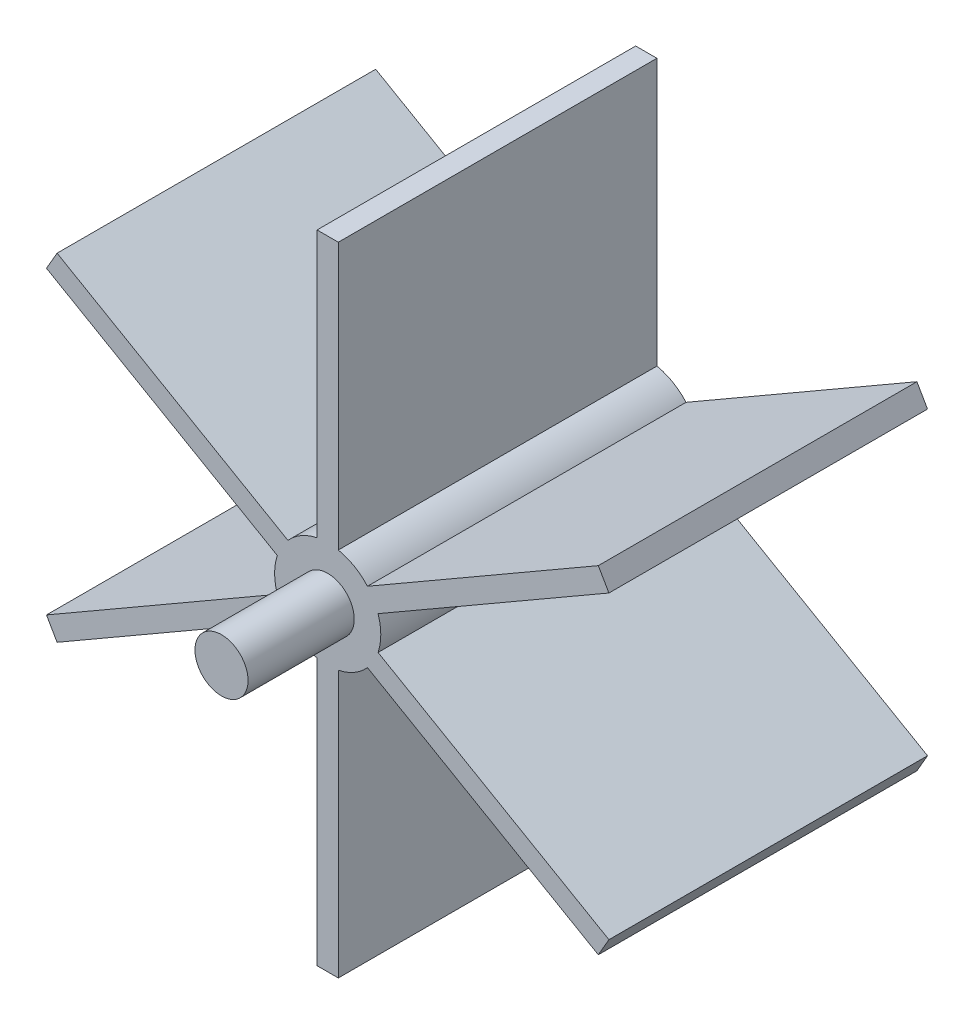
ISO-10303-21;
HEADER;
FILE_DESCRIPTION(('STEP AP214'),'2;1');
FILE_NAME('part.step','',(''),(''),'','','');
FILE_SCHEMA(('AUTOMOTIVE_DESIGN { 1 0 10303 214 1 1 1 1 }'));
ENDSEC;
DATA;
#1=APPLICATION_CONTEXT('core data for automotive mechanical design processes');
#2=APPLICATION_PROTOCOL_DEFINITION('international standard','automotive_design',2000,#1);
#3=PRODUCT_CONTEXT('',#1,'mechanical');
#4=PRODUCT('Part','Part','',(#3));
#5=PRODUCT_RELATED_PRODUCT_CATEGORY('part','',(#4));
#6=PRODUCT_DEFINITION_FORMATION('','',#4);
#7=PRODUCT_DEFINITION_CONTEXT('part definition',#1,'design');
#8=PRODUCT_DEFINITION('design','',#6,#7);
#9=PRODUCT_DEFINITION_SHAPE('','',#8);
#10=(LENGTH_UNIT() NAMED_UNIT(*) SI_UNIT(.MILLI.,.METRE.));
#11=(NAMED_UNIT(*) PLANE_ANGLE_UNIT() SI_UNIT($,.RADIAN.));
#12=(NAMED_UNIT(*) SI_UNIT($,.STERADIAN.) SOLID_ANGLE_UNIT());
#13=UNCERTAINTY_MEASURE_WITH_UNIT(LENGTH_MEASURE(1.E-05),#10,'distance_accuracy_value','');
#14=(GEOMETRIC_REPRESENTATION_CONTEXT(3) GLOBAL_UNCERTAINTY_ASSIGNED_CONTEXT((#13)) GLOBAL_UNIT_ASSIGNED_CONTEXT((#10,
#11,#12)) REPRESENTATION_CONTEXT('',''));
#15=CARTESIAN_POINT('',(0.,0.,0.));
#16=DIRECTION('',(0.,0.,1.));
#17=DIRECTION('',(1.,0.,0.));
#18=AXIS2_PLACEMENT_3D('',#15,#16,#17);
#19=CARTESIAN_POINT('',(1.27,2.19970452561247,76.2));
#20=DIRECTION('',(-0.5,-0.866025403784439,0.));
#21=DIRECTION('',(0.866025403784438,-0.5,0.));
#22=AXIS2_PLACEMENT_3D('',#19,#20,#21);
#23=PLANE('',#22);
#24=DIRECTION('',(-0.866025403784439,0.5,0.));
#25=VECTOR('',#24,1.);
#26=CARTESIAN_POINT('',(1.27,2.19970452561247,0.));
#27=LINE('',#26,#25);
#28=CARTESIAN_POINT('',(-9.50630734528298,8.42140847228175,0.));
#29=VERTEX_POINT('',#28);
#30=CARTESIAN_POINT('',(-64.7211357683742,40.2997045256125,0.));
#31=VERTEX_POINT('',#30);
#32=EDGE_CURVE('E522',#29,#31,#27,.T.);
#33=ORIENTED_EDGE('',*,*,#32,.T.);
#34=DIRECTION('',(0.,0.,-1.));
#35=VECTOR('',#34,1.);
#36=CARTESIAN_POINT('',(-64.7211357683742,40.2997045256125,76.2));
#37=LINE('',#36,#35);
#38=CARTESIAN_POINT('',(-64.7211357683742,40.2997045256125,76.2));
#39=VERTEX_POINT('',#38);
#40=EDGE_CURVE('E142',#39,#31,#37,.T.);
#41=ORIENTED_EDGE('',*,*,#40,.F.);
#42=DIRECTION('',(-0.866025403784439,0.5,0.));
#43=VECTOR('',#42,1.);
#44=CARTESIAN_POINT('',(1.27,2.19970452561247,76.2));
#45=LINE('',#44,#43);
#46=CARTESIAN_POINT('',(-9.50630734528298,8.42140847228175,76.2));
#47=VERTEX_POINT('',#46);
#48=EDGE_CURVE('E511',#47,#39,#45,.T.);
#49=ORIENTED_EDGE('',*,*,#48,.F.);
#50=DIRECTION('',(0.,0.,-1.));
#51=VECTOR('',#50,1.);
#52=CARTESIAN_POINT('',(-9.50630734528298,8.42140847228175,76.2));
#53=LINE('',#52,#51);
#54=EDGE_CURVE('E12',#47,#29,#53,.T.);
#55=ORIENTED_EDGE('',*,*,#54,.T.);
#56=EDGE_LOOP('',(#33,#41,#49,#55));
#57=FACE_BOUND('',#56,.T.);
#58=ADVANCED_FACE('F131',(#57),#23,.F.);
#59=CARTESIAN_POINT('',(-65.9911357683741,38.1000000000002,76.2));
#60=DIRECTION('',(-0.866025403784437,0.500000000000002,0.));
#61=DIRECTION('',(-0.500000000000002,-0.866025403784437,0.));
#62=AXIS2_PLACEMENT_3D('',#59,#60,#61);
#63=PLANE('',#62);
#64=DIRECTION('',(0.500000000000002,0.866025403784438,0.));
#65=VECTOR('',#64,1.);
#66=CARTESIAN_POINT('',(-65.9911357683741,38.1000000000002,0.));
#67=LINE('',#66,#65);
#68=CARTESIAN_POINT('',(-67.2611357683743,35.9002954743875,0.));
#69=VERTEX_POINT('',#68);
#70=EDGE_CURVE('E526',#69,#31,#67,.T.);
#71=ORIENTED_EDGE('',*,*,#70,.F.);
#72=DIRECTION('',(0.,0.,-1.));
#73=VECTOR('',#72,1.);
#74=CARTESIAN_POINT('',(-67.2611357683743,35.9002954743875,76.2));
#75=LINE('',#74,#73);
#76=CARTESIAN_POINT('',(-67.2611357683743,35.9002954743875,76.2));
#77=VERTEX_POINT('',#76);
#78=EDGE_CURVE('E534',#77,#69,#75,.T.);
#79=ORIENTED_EDGE('',*,*,#78,.F.);
#80=DIRECTION('',(0.500000000000002,0.866025403784438,0.));
#81=VECTOR('',#80,1.);
#82=CARTESIAN_POINT('',(-65.9911357683741,38.1000000000002,76.2));
#83=LINE('',#82,#81);
#84=EDGE_CURVE('E514',#77,#39,#83,.T.);
#85=ORIENTED_EDGE('',*,*,#84,.T.);
#86=ORIENTED_EDGE('',*,*,#40,.T.);
#87=EDGE_LOOP('',(#71,#79,#85,#86));
#88=FACE_BOUND('',#87,.T.);
#89=ADVANCED_FACE('F598',(#88),#63,.T.);
#90=CARTESIAN_POINT('',(-1.27,-2.19970452561247,76.2));
#91=DIRECTION('',(-0.5,-0.866025403784439,0.));
#92=DIRECTION('',(0.866025403784439,-0.5,0.));
#93=AXIS2_PLACEMENT_3D('',#90,#91,#92);
#94=PLANE('',#93);
#95=DIRECTION('',(-0.866025403784439,0.5,0.));
#96=VECTOR('',#95,1.);
#97=CARTESIAN_POINT('',(-1.27,-2.19970452561247,0.));
#98=LINE('',#97,#96);
#99=CARTESIAN_POINT('',(-12.046307345283,4.0219994210568,0.));
#100=VERTEX_POINT('',#99);
#101=EDGE_CURVE('E515',#100,#69,#98,.T.);
#102=ORIENTED_EDGE('',*,*,#101,.F.);
#103=DIRECTION('',(0.,0.,-1.));
#104=VECTOR('',#103,1.);
#105=CARTESIAN_POINT('',(-12.046307345283,4.0219994210568,76.2));
#106=LINE('',#105,#104);
#107=CARTESIAN_POINT('',(-12.046307345283,4.0219994210568,76.2));
#108=VERTEX_POINT('',#107);
#109=EDGE_CURVE('E151',#108,#100,#106,.T.);
#110=ORIENTED_EDGE('',*,*,#109,.F.);
#111=DIRECTION('',(-0.866025403784439,0.5,0.));
#112=VECTOR('',#111,1.);
#113=CARTESIAN_POINT('',(-1.27,-2.19970452561247,76.2));
#114=LINE('',#113,#112);
#115=EDGE_CURVE('E519',#108,#77,#114,.T.);
#116=ORIENTED_EDGE('',*,*,#115,.T.);
#117=ORIENTED_EDGE('',*,*,#78,.T.);
#118=EDGE_LOOP('',(#102,#110,#116,#117));
#119=FACE_BOUND('',#118,.T.);
#120=ADVANCED_FACE('F596',(#119),#94,.T.);
#121=CARTESIAN_POINT('',(0.,0.,0.));
#122=DIRECTION('',(0.,0.,1.));
#123=DIRECTION('',(1.,0.,0.));
#124=AXIS2_PLACEMENT_3D('',#121,#122,#123);
#125=PLANE('',#124);
#126=ORIENTED_EDGE('',*,*,#32,.F.);
#127=CARTESIAN_POINT('',(0.,0.,0.));
#128=DIRECTION('',(0.,0.,1.));
#129=DIRECTION('',(1.,0.,0.));
#130=AXIS2_PLACEMENT_3D('',#127,#128,#129);
#131=CIRCLE('',#130,12.7);
#132=CARTESIAN_POINT('',(-2.54,12.4434078933385,0.));
#133=VERTEX_POINT('',#132);
#134=EDGE_CURVE('E496',#133,#29,#131,.T.);
#135=ORIENTED_EDGE('',*,*,#134,.F.);
#136=DIRECTION('',(0.,1.,0.));
#137=VECTOR('',#136,1.);
#138=CARTESIAN_POINT('',(-2.54,0.,0.));
#139=LINE('',#138,#137);
#140=CARTESIAN_POINT('',(-2.54,76.2,0.));
#141=VERTEX_POINT('',#140);
#142=EDGE_CURVE('E543',#133,#141,#139,.T.);
#143=ORIENTED_EDGE('',*,*,#142,.T.);
#144=DIRECTION('',(1.,0.,0.));
#145=VECTOR('',#144,1.);
#146=CARTESIAN_POINT('',(0.,76.2,0.));
#147=LINE('',#146,#145);
#148=CARTESIAN_POINT('',(2.54,76.2,0.));
#149=VERTEX_POINT('',#148);
#150=EDGE_CURVE('E555',#141,#149,#147,.T.);
#151=ORIENTED_EDGE('',*,*,#150,.T.);
#152=DIRECTION('',(0.,1.,0.));
#153=VECTOR('',#152,1.);
#154=CARTESIAN_POINT('',(2.54,0.,0.));
#155=LINE('',#154,#153);
#156=CARTESIAN_POINT('',(2.54,12.4434078933385,0.));
#157=VERTEX_POINT('',#156);
#158=EDGE_CURVE('E416',#157,#149,#155,.T.);
#159=ORIENTED_EDGE('',*,*,#158,.F.);
#160=CARTESIAN_POINT('',(9.50630734528298,8.42140847228175,0.));
#161=VERTEX_POINT('',#160);
#162=EDGE_CURVE('E501',#161,#157,#131,.T.);
#163=ORIENTED_EDGE('',*,*,#162,.F.);
#164=DIRECTION('',(0.866025403784439,0.5,0.));
#165=VECTOR('',#164,1.);
#166=CARTESIAN_POINT('',(-1.27,2.19970452561247,0.));
#167=LINE('',#166,#165);
#168=CARTESIAN_POINT('',(64.7211357683742,40.2997045256125,0.));
#169=VERTEX_POINT('',#168);
#170=EDGE_CURVE('E383',#161,#169,#167,.T.);
#171=ORIENTED_EDGE('',*,*,#170,.T.);
#172=DIRECTION('',(0.500000000000002,-0.866025403784438,0.));
#173=VECTOR('',#172,1.);
#174=CARTESIAN_POINT('',(65.9911357683741,38.1000000000002,0.));
#175=LINE('',#174,#173);
#176=CARTESIAN_POINT('',(67.2611357683743,35.9002954743875,0.));
#177=VERTEX_POINT('',#176);
#178=EDGE_CURVE('E390',#169,#177,#175,.T.);
#179=ORIENTED_EDGE('',*,*,#178,.T.);
#180=DIRECTION('',(0.866025403784439,0.5,0.));
#181=VECTOR('',#180,1.);
#182=CARTESIAN_POINT('',(1.27,-2.19970452561247,0.));
#183=LINE('',#182,#181);
#184=CARTESIAN_POINT('',(12.046307345283,4.0219994210568,0.));
#185=VERTEX_POINT('',#184);
#186=EDGE_CURVE('E400',#185,#177,#183,.T.);
#187=ORIENTED_EDGE('',*,*,#186,.F.);
#188=CARTESIAN_POINT('',(12.046307345283,-4.0219994210568,0.));
#189=VERTEX_POINT('',#188);
#190=EDGE_CURVE('E581',#189,#185,#131,.T.);
#191=ORIENTED_EDGE('',*,*,#190,.F.);
#192=DIRECTION('',(0.866025403784439,-0.5,0.));
#193=VECTOR('',#192,1.);
#194=CARTESIAN_POINT('',(1.27,2.19970452561247,0.));
#195=LINE('',#194,#193);
#196=CARTESIAN_POINT('',(67.2611357683743,-35.9002954743876,0.));
#197=VERTEX_POINT('',#196);
#198=EDGE_CURVE('E421',#189,#197,#195,.T.);
#199=ORIENTED_EDGE('',*,*,#198,.T.);
#200=DIRECTION('',(0.500000000000002,0.866025403784438,0.));
#201=VECTOR('',#200,1.);
#202=CARTESIAN_POINT('',(65.9911357683742,-38.1000000000002,0.));
#203=LINE('',#202,#201);
#204=CARTESIAN_POINT('',(64.7211357683743,-40.2997045256125,0.));
#205=VERTEX_POINT('',#204);
#206=EDGE_CURVE('E430',#205,#197,#203,.T.);
#207=ORIENTED_EDGE('',*,*,#206,.F.);
#208=DIRECTION('',(0.866025403784439,-0.5,0.));
#209=VECTOR('',#208,1.);
#210=CARTESIAN_POINT('',(-1.27,-2.19970452561247,0.));
#211=LINE('',#210,#209);
#212=CARTESIAN_POINT('',(9.50630734528298,-8.42140847228175,0.));
#213=VERTEX_POINT('',#212);
#214=EDGE_CURVE('E427',#213,#205,#211,.T.);
#215=ORIENTED_EDGE('',*,*,#214,.F.);
#216=CARTESIAN_POINT('',(2.54,-12.4434078933385,0.));
#217=VERTEX_POINT('',#216);
#218=EDGE_CURVE('E314',#217,#213,#131,.T.);
#219=ORIENTED_EDGE('',*,*,#218,.F.);
#220=DIRECTION('',(0.,-1.,0.));
#221=VECTOR('',#220,1.);
#222=CARTESIAN_POINT('',(2.54,0.,0.));
#223=LINE('',#222,#221);
#224=CARTESIAN_POINT('',(2.54,-76.2,0.));
#225=VERTEX_POINT('',#224);
#226=EDGE_CURVE('E453',#217,#225,#223,.T.);
#227=ORIENTED_EDGE('',*,*,#226,.T.);
#228=DIRECTION('',(-1.,0.,0.));
#229=VECTOR('',#228,1.);
#230=CARTESIAN_POINT('',(0.,-76.2,0.));
#231=LINE('',#230,#229);
#232=CARTESIAN_POINT('',(-2.54,-76.2,0.));
#233=VERTEX_POINT('',#232);
#234=EDGE_CURVE('E464',#225,#233,#231,.T.);
#235=ORIENTED_EDGE('',*,*,#234,.T.);
#236=DIRECTION('',(0.,-1.,0.));
#237=VECTOR('',#236,1.);
#238=CARTESIAN_POINT('',(-2.54,0.,0.));
#239=LINE('',#238,#237);
#240=CARTESIAN_POINT('',(-2.54,-12.4434078933385,0.));
#241=VERTEX_POINT('',#240);
#242=EDGE_CURVE('E311',#241,#233,#239,.T.);
#243=ORIENTED_EDGE('',*,*,#242,.F.);
#244=CARTESIAN_POINT('',(-9.50630734528298,-8.42140847228175,0.));
#245=VERTEX_POINT('',#244);
#246=EDGE_CURVE('E135',#245,#241,#131,.T.);
#247=ORIENTED_EDGE('',*,*,#246,.F.);
#248=DIRECTION('',(-0.866025403784439,-0.5,0.));
#249=VECTOR('',#248,1.);
#250=CARTESIAN_POINT('',(1.27,-2.19970452561247,0.));
#251=LINE('',#250,#249);
#252=CARTESIAN_POINT('',(-64.7211357683742,-40.2997045256125,0.));
#253=VERTEX_POINT('',#252);
#254=EDGE_CURVE('E308',#245,#253,#251,.T.);
#255=ORIENTED_EDGE('',*,*,#254,.T.);
#256=DIRECTION('',(-0.500000000000002,0.866025403784438,0.));
#257=VECTOR('',#256,1.);
#258=CARTESIAN_POINT('',(-65.9911357683741,-38.1000000000002,0.));
#259=LINE('',#258,#257);
#260=CARTESIAN_POINT('',(-67.2611357683742,-35.9002954743875,0.));
#261=VERTEX_POINT('',#260);
#262=EDGE_CURVE('E319',#253,#261,#259,.T.);
#263=ORIENTED_EDGE('',*,*,#262,.T.);
#264=DIRECTION('',(-0.866025403784439,-0.5,0.));
#265=VECTOR('',#264,1.);
#266=CARTESIAN_POINT('',(-1.27,2.19970452561247,0.));
#267=LINE('',#266,#265);
#268=CARTESIAN_POINT('',(-12.046307345283,-4.0219994210568,0.));
#269=VERTEX_POINT('',#268);
#270=EDGE_CURVE('E325',#269,#261,#267,.T.);
#271=ORIENTED_EDGE('',*,*,#270,.F.);
#272=EDGE_CURVE('E315',#100,#269,#131,.T.);
#273=ORIENTED_EDGE('',*,*,#272,.F.);
#274=ORIENTED_EDGE('',*,*,#101,.T.);
#275=ORIENTED_EDGE('',*,*,#70,.T.);
#276=EDGE_LOOP('',(#126,#135,#143,#151,#159,#163,#171,#179,#187,#191,#199,#207,#215,#219,#227,
#235,#243,#247,#255,#263,#271,#273,#274,#275));
#277=FACE_BOUND('',#276,.T.);
#278=ADVANCED_FACE('F306',(#277),#125,.F.);
#279=CARTESIAN_POINT('',(0.,0.,76.2));
#280=DIRECTION('',(0.,0.,1.));
#281=DIRECTION('',(1.,0.,0.));
#282=AXIS2_PLACEMENT_3D('',#279,#280,#281);
#283=PLANE('',#282);
#284=CARTESIAN_POINT('',(0.,0.,76.2));
#285=DIRECTION('',(0.,0.,1.));
#286=DIRECTION('',(1.,0.,0.));
#287=AXIS2_PLACEMENT_3D('',#284,#285,#286);
#288=CIRCLE('',#287,6.35);
#289=CARTESIAN_POINT('',(6.35,0.,76.2));
#290=VERTEX_POINT('',#289);
#291=EDGE_CURVE('E503',#290,#290,#288,.T.);
#292=ORIENTED_EDGE('',*,*,#291,.F.);
#293=EDGE_LOOP('',(#292));
#294=FACE_BOUND('',#293,.T.);
#295=ORIENTED_EDGE('',*,*,#115,.F.);
#296=CARTESIAN_POINT('',(0.,0.,76.2));
#297=DIRECTION('',(0.,0.,1.));
#298=DIRECTION('',(1.,0.,0.));
#299=AXIS2_PLACEMENT_3D('',#296,#297,#298);
#300=CIRCLE('',#299,12.7);
#301=CARTESIAN_POINT('',(-12.046307345283,-4.0219994210568,76.2));
#302=VERTEX_POINT('',#301);
#303=EDGE_CURVE('E313',#108,#302,#300,.T.);
#304=ORIENTED_EDGE('',*,*,#303,.T.);
#305=DIRECTION('',(-0.866025403784439,-0.5,0.));
#306=VECTOR('',#305,1.);
#307=CARTESIAN_POINT('',(-1.27,2.19970452561247,76.2));
#308=LINE('',#307,#306);
#309=CARTESIAN_POINT('',(-67.2611357683742,-35.9002954743875,76.2));
#310=VERTEX_POINT('',#309);
#311=EDGE_CURVE('E318',#302,#310,#308,.T.);
#312=ORIENTED_EDGE('',*,*,#311,.T.);
#313=DIRECTION('',(-0.500000000000002,0.866025403784438,0.));
#314=VECTOR('',#313,1.);
#315=CARTESIAN_POINT('',(-65.9911357683741,-38.1000000000002,76.2));
#316=LINE('',#315,#314);
#317=CARTESIAN_POINT('',(-64.7211357683742,-40.2997045256125,76.2));
#318=VERTEX_POINT('',#317);
#319=EDGE_CURVE('E323',#318,#310,#316,.T.);
#320=ORIENTED_EDGE('',*,*,#319,.F.);
#321=DIRECTION('',(-0.866025403784439,-0.5,0.));
#322=VECTOR('',#321,1.);
#323=CARTESIAN_POINT('',(1.27,-2.19970452561247,76.2));
#324=LINE('',#323,#322);
#325=CARTESIAN_POINT('',(-9.50630734528298,-8.42140847228175,76.2));
#326=VERTEX_POINT('',#325);
#327=EDGE_CURVE('E301',#326,#318,#324,.T.);
#328=ORIENTED_EDGE('',*,*,#327,.F.);
#329=CARTESIAN_POINT('',(-2.54,-12.4434078933385,76.2));
#330=VERTEX_POINT('',#329);
#331=EDGE_CURVE('E298',#326,#330,#300,.T.);
#332=ORIENTED_EDGE('',*,*,#331,.T.);
#333=DIRECTION('',(0.,-1.,0.));
#334=VECTOR('',#333,1.);
#335=CARTESIAN_POINT('',(-2.54,0.,76.2));
#336=LINE('',#335,#334);
#337=CARTESIAN_POINT('',(-2.54,-76.2,76.2));
#338=VERTEX_POINT('',#337);
#339=EDGE_CURVE('E449',#330,#338,#336,.T.);
#340=ORIENTED_EDGE('',*,*,#339,.T.);
#341=DIRECTION('',(-1.,0.,0.));
#342=VECTOR('',#341,1.);
#343=CARTESIAN_POINT('',(0.,-76.2,76.2));
#344=LINE('',#343,#342);
#345=CARTESIAN_POINT('',(2.54,-76.2,76.2));
#346=VERTEX_POINT('',#345);
#347=EDGE_CURVE('E452',#346,#338,#344,.T.);
#348=ORIENTED_EDGE('',*,*,#347,.F.);
#349=DIRECTION('',(0.,-1.,0.));
#350=VECTOR('',#349,1.);
#351=CARTESIAN_POINT('',(2.54,0.,76.2));
#352=LINE('',#351,#350);
#353=CARTESIAN_POINT('',(2.54,-12.4434078933385,76.2));
#354=VERTEX_POINT('',#353);
#355=EDGE_CURVE('E457',#354,#346,#352,.T.);
#356=ORIENTED_EDGE('',*,*,#355,.F.);
#357=CARTESIAN_POINT('',(9.50630734528298,-8.42140847228175,76.2));
#358=VERTEX_POINT('',#357);
#359=EDGE_CURVE('E338',#354,#358,#300,.T.);
#360=ORIENTED_EDGE('',*,*,#359,.T.);
#361=DIRECTION('',(0.866025403784439,-0.5,0.));
#362=VECTOR('',#361,1.);
#363=CARTESIAN_POINT('',(-1.27,-2.19970452561247,76.2));
#364=LINE('',#363,#362);
#365=CARTESIAN_POINT('',(64.7211357683743,-40.2997045256125,76.2));
#366=VERTEX_POINT('',#365);
#367=EDGE_CURVE('E417',#358,#366,#364,.T.);
#368=ORIENTED_EDGE('',*,*,#367,.T.);
#369=DIRECTION('',(0.500000000000002,0.866025403784438,0.));
#370=VECTOR('',#369,1.);
#371=CARTESIAN_POINT('',(65.9911357683742,-38.1000000000002,76.2));
#372=LINE('',#371,#370);
#373=CARTESIAN_POINT('',(67.2611357683743,-35.9002954743876,76.2));
#374=VERTEX_POINT('',#373);
#375=EDGE_CURVE('E420',#366,#374,#372,.T.);
#376=ORIENTED_EDGE('',*,*,#375,.T.);
#377=DIRECTION('',(0.866025403784439,-0.5,0.));
#378=VECTOR('',#377,1.);
#379=CARTESIAN_POINT('',(1.27,2.19970452561247,76.2));
#380=LINE('',#379,#378);
#381=CARTESIAN_POINT('',(12.046307345283,-4.0219994210568,76.2));
#382=VERTEX_POINT('',#381);
#383=EDGE_CURVE('E372',#382,#374,#380,.T.);
#384=ORIENTED_EDGE('',*,*,#383,.F.);
#385=CARTESIAN_POINT('',(12.046307345283,4.0219994210568,76.2));
#386=VERTEX_POINT('',#385);
#387=EDGE_CURVE('E345',#382,#386,#300,.T.);
#388=ORIENTED_EDGE('',*,*,#387,.T.);
#389=DIRECTION('',(0.866025403784439,0.5,0.));
#390=VECTOR('',#389,1.);
#391=CARTESIAN_POINT('',(1.27,-2.19970452561247,76.2));
#392=LINE('',#391,#390);
#393=CARTESIAN_POINT('',(67.2611357683743,35.9002954743875,76.2));
#394=VERTEX_POINT('',#393);
#395=EDGE_CURVE('E369',#386,#394,#392,.T.);
#396=ORIENTED_EDGE('',*,*,#395,.T.);
#397=DIRECTION('',(0.500000000000002,-0.866025403784438,0.));
#398=VECTOR('',#397,1.);
#399=CARTESIAN_POINT('',(65.9911357683741,38.1000000000002,76.2));
#400=LINE('',#399,#398);
#401=CARTESIAN_POINT('',(64.7211357683742,40.2997045256125,76.2));
#402=VERTEX_POINT('',#401);
#403=EDGE_CURVE('E382',#402,#394,#400,.T.);
#404=ORIENTED_EDGE('',*,*,#403,.F.);
#405=DIRECTION('',(0.866025403784439,0.5,0.));
#406=VECTOR('',#405,1.);
#407=CARTESIAN_POINT('',(-1.27,2.19970452561247,76.2));
#408=LINE('',#407,#406);
#409=CARTESIAN_POINT('',(9.50630734528298,8.42140847228175,76.2));
#410=VERTEX_POINT('',#409);
#411=EDGE_CURVE('E387',#410,#402,#408,.T.);
#412=ORIENTED_EDGE('',*,*,#411,.F.);
#413=CARTESIAN_POINT('',(2.54,12.4434078933385,76.2));
#414=VERTEX_POINT('',#413);
#415=EDGE_CURVE('E352',#410,#414,#300,.T.);
#416=ORIENTED_EDGE('',*,*,#415,.T.);
#417=DIRECTION('',(0.,1.,0.));
#418=VECTOR('',#417,1.);
#419=CARTESIAN_POINT('',(2.54,0.,76.2));
#420=LINE('',#419,#418);
#421=CARTESIAN_POINT('',(2.54,76.2,76.2));
#422=VERTEX_POINT('',#421);
#423=EDGE_CURVE('E539',#414,#422,#420,.T.);
#424=ORIENTED_EDGE('',*,*,#423,.T.);
#425=DIRECTION('',(1.,0.,0.));
#426=VECTOR('',#425,1.);
#427=CARTESIAN_POINT('',(0.,76.2,76.2));
#428=LINE('',#427,#426);
#429=CARTESIAN_POINT('',(-2.54,76.2,76.2));
#430=VERTEX_POINT('',#429);
#431=EDGE_CURVE('E542',#430,#422,#428,.T.);
#432=ORIENTED_EDGE('',*,*,#431,.F.);
#433=DIRECTION('',(0.,1.,0.));
#434=VECTOR('',#433,1.);
#435=CARTESIAN_POINT('',(-2.54,0.,76.2));
#436=LINE('',#435,#434);
#437=CARTESIAN_POINT('',(-2.54,12.4434078933385,76.2));
#438=VERTEX_POINT('',#437);
#439=EDGE_CURVE('E547',#438,#430,#436,.T.);
#440=ORIENTED_EDGE('',*,*,#439,.F.);
#441=EDGE_CURVE('E347',#438,#47,#300,.T.);
#442=ORIENTED_EDGE('',*,*,#441,.T.);
#443=ORIENTED_EDGE('',*,*,#48,.T.);
#444=ORIENTED_EDGE('',*,*,#84,.F.);
#445=EDGE_LOOP('',(#295,#304,#312,#320,#328,#332,#340,#348,#356,#360,#368,#376,#384,#388,#396,
#404,#412,#416,#424,#432,#440,#442,#443,#444));
#446=FACE_BOUND('',#445,.T.);
#447=ADVANCED_FACE('F367',(#294,#446),#283,.T.);
#448=CARTESIAN_POINT('',(-2.54,0.,76.2));
#449=DIRECTION('',(1.,0.,0.));
#450=DIRECTION('',(0.,0.,-1.));
#451=AXIS2_PLACEMENT_3D('',#448,#449,#450);
#452=PLANE('',#451);
#453=ORIENTED_EDGE('',*,*,#242,.T.);
#454=DIRECTION('',(0.,0.,-1.));
#455=VECTOR('',#454,1.);
#456=CARTESIAN_POINT('',(-2.54,-76.2,76.2));
#457=LINE('',#456,#455);
#458=EDGE_CURVE('E475',#338,#233,#457,.T.);
#459=ORIENTED_EDGE('',*,*,#458,.F.);
#460=ORIENTED_EDGE('',*,*,#339,.F.);
#461=DIRECTION('',(0.,0.,-1.));
#462=VECTOR('',#461,1.);
#463=CARTESIAN_POINT('',(-2.54,-12.4434078933385,76.2));
#464=LINE('',#463,#462);
#465=EDGE_CURVE('E431',#330,#241,#464,.T.);
#466=ORIENTED_EDGE('',*,*,#465,.T.);
#467=EDGE_LOOP('',(#453,#459,#460,#466));
#468=FACE_BOUND('',#467,.T.);
#469=ADVANCED_FACE('F646',(#468),#452,.F.);
#470=CARTESIAN_POINT('',(0.,-76.2,76.2));
#471=DIRECTION('',(0.,-1.,0.));
#472=DIRECTION('',(0.,0.,-1.));
#473=AXIS2_PLACEMENT_3D('',#470,#471,#472);
#474=PLANE('',#473);
#475=ORIENTED_EDGE('',*,*,#234,.F.);
#476=DIRECTION('',(0.,0.,-1.));
#477=VECTOR('',#476,1.);
#478=CARTESIAN_POINT('',(2.54,-76.2,76.2));
#479=LINE('',#478,#477);
#480=EDGE_CURVE('E472',#346,#225,#479,.T.);
#481=ORIENTED_EDGE('',*,*,#480,.F.);
#482=ORIENTED_EDGE('',*,*,#347,.T.);
#483=ORIENTED_EDGE('',*,*,#458,.T.);
#484=EDGE_LOOP('',(#475,#481,#482,#483));
#485=FACE_BOUND('',#484,.T.);
#486=ADVANCED_FACE('F642',(#485),#474,.T.);
#487=CARTESIAN_POINT('',(2.54,0.,76.2));
#488=DIRECTION('',(1.,0.,0.));
#489=DIRECTION('',(0.,0.,-1.));
#490=AXIS2_PLACEMENT_3D('',#487,#488,#489);
#491=PLANE('',#490);
#492=ORIENTED_EDGE('',*,*,#226,.F.);
#493=DIRECTION('',(0.,0.,-1.));
#494=VECTOR('',#493,1.);
#495=CARTESIAN_POINT('',(2.54,-12.4434078933385,76.2));
#496=LINE('',#495,#494);
#497=EDGE_CURVE('E461',#354,#217,#496,.T.);
#498=ORIENTED_EDGE('',*,*,#497,.F.);
#499=ORIENTED_EDGE('',*,*,#355,.T.);
#500=ORIENTED_EDGE('',*,*,#480,.T.);
#501=EDGE_LOOP('',(#492,#498,#499,#500));
#502=FACE_BOUND('',#501,.T.);
#503=ADVANCED_FACE('F638',(#502),#491,.T.);
#504=CARTESIAN_POINT('',(-1.27,-2.19970452561247,76.2));
#505=DIRECTION('',(0.5,0.866025403784439,0.));
#506=DIRECTION('',(-0.866025403784438,0.5,0.));
#507=AXIS2_PLACEMENT_3D('',#504,#505,#506);
#508=PLANE('',#507);
#509=ORIENTED_EDGE('',*,*,#214,.T.);
#510=DIRECTION('',(0.,0.,-1.));
#511=VECTOR('',#510,1.);
#512=CARTESIAN_POINT('',(64.7211357683743,-40.2997045256125,76.2));
#513=LINE('',#512,#511);
#514=EDGE_CURVE('E443',#366,#205,#513,.T.);
#515=ORIENTED_EDGE('',*,*,#514,.F.);
#516=ORIENTED_EDGE('',*,*,#367,.F.);
#517=DIRECTION('',(0.,0.,-1.));
#518=VECTOR('',#517,1.);
#519=CARTESIAN_POINT('',(9.50630734528298,-8.42140847228175,76.2));
#520=LINE('',#519,#518);
#521=EDGE_CURVE('E403',#358,#213,#520,.T.);
#522=ORIENTED_EDGE('',*,*,#521,.T.);
#523=EDGE_LOOP('',(#509,#515,#516,#522));
#524=FACE_BOUND('',#523,.T.);
#525=ADVANCED_FACE('F634',(#524),#508,.F.);
#526=CARTESIAN_POINT('',(65.9911357683742,-38.1000000000002,76.2));
#527=DIRECTION('',(-0.866025403784437,0.500000000000002,0.));
#528=DIRECTION('',(-0.500000000000002,-0.866025403784437,0.));
#529=AXIS2_PLACEMENT_3D('',#526,#527,#528);
#530=PLANE('',#529);
#531=ORIENTED_EDGE('',*,*,#206,.T.);
#532=DIRECTION('',(0.,0.,-1.));
#533=VECTOR('',#532,1.);
#534=CARTESIAN_POINT('',(67.2611357683743,-35.9002954743876,76.2));
#535=LINE('',#534,#533);
#536=EDGE_CURVE('E440',#374,#197,#535,.T.);
#537=ORIENTED_EDGE('',*,*,#536,.F.);
#538=ORIENTED_EDGE('',*,*,#375,.F.);
#539=ORIENTED_EDGE('',*,*,#514,.T.);
#540=EDGE_LOOP('',(#531,#537,#538,#539));
#541=FACE_BOUND('',#540,.T.);
#542=ADVANCED_FACE('F629',(#541),#530,.F.);
#543=CARTESIAN_POINT('',(1.27,2.19970452561247,76.2));
#544=DIRECTION('',(0.5,0.866025403784439,0.));
#545=DIRECTION('',(-0.866025403784439,0.5,0.));
#546=AXIS2_PLACEMENT_3D('',#543,#544,#545);
#547=PLANE('',#546);
#548=ORIENTED_EDGE('',*,*,#198,.F.);
#549=DIRECTION('',(0.,0.,-1.));
#550=VECTOR('',#549,1.);
#551=CARTESIAN_POINT('',(12.046307345283,-4.0219994210568,76.2));
#552=LINE('',#551,#550);
#553=EDGE_CURVE('E426',#382,#189,#552,.T.);
#554=ORIENTED_EDGE('',*,*,#553,.F.);
#555=ORIENTED_EDGE('',*,*,#383,.T.);
#556=ORIENTED_EDGE('',*,*,#536,.T.);
#557=EDGE_LOOP('',(#548,#554,#555,#556));
#558=FACE_BOUND('',#557,.T.);
#559=ADVANCED_FACE('F626',(#558),#547,.T.);
#560=CARTESIAN_POINT('',(1.27,-2.19970452561247,76.2));
#561=DIRECTION('',(-0.5,0.866025403784439,0.));
#562=DIRECTION('',(-0.866025403784439,-0.5,0.));
#563=AXIS2_PLACEMENT_3D('',#560,#561,#562);
#564=PLANE('',#563);
#565=ORIENTED_EDGE('',*,*,#186,.T.);
#566=DIRECTION('',(0.,0.,-1.));
#567=VECTOR('',#566,1.);
#568=CARTESIAN_POINT('',(67.2611357683743,35.9002954743875,76.2));
#569=LINE('',#568,#567);
#570=EDGE_CURVE('E379',#394,#177,#569,.T.);
#571=ORIENTED_EDGE('',*,*,#570,.F.);
#572=ORIENTED_EDGE('',*,*,#395,.F.);
#573=DIRECTION('',(0.,0.,-1.));
#574=VECTOR('',#573,1.);
#575=CARTESIAN_POINT('',(12.046307345283,4.0219994210568,76.2));
#576=LINE('',#575,#574);
#577=EDGE_CURVE('E377',#386,#185,#576,.T.);
#578=ORIENTED_EDGE('',*,*,#577,.T.);
#579=EDGE_LOOP('',(#565,#571,#572,#578));
#580=FACE_BOUND('',#579,.T.);
#581=ADVANCED_FACE('F376',(#580),#564,.F.);
#582=CARTESIAN_POINT('',(65.9911357683741,38.1000000000002,76.2));
#583=DIRECTION('',(0.866025403784437,0.500000000000002,0.));
#584=DIRECTION('',(-0.500000000000002,0.866025403784437,0.));
#585=AXIS2_PLACEMENT_3D('',#582,#583,#584);
#586=PLANE('',#585);
#587=ORIENTED_EDGE('',*,*,#178,.F.);
#588=DIRECTION('',(0.,0.,-1.));
#589=VECTOR('',#588,1.);
#590=CARTESIAN_POINT('',(64.7211357683742,40.2997045256125,76.2));
#591=LINE('',#590,#589);
#592=EDGE_CURVE('E409',#402,#169,#591,.T.);
#593=ORIENTED_EDGE('',*,*,#592,.F.);
#594=ORIENTED_EDGE('',*,*,#403,.T.);
#595=ORIENTED_EDGE('',*,*,#570,.T.);
#596=EDGE_LOOP('',(#587,#593,#594,#595));
#597=FACE_BOUND('',#596,.T.);
#598=ADVANCED_FACE('F618',(#597),#586,.T.);
#599=CARTESIAN_POINT('',(-1.27,2.19970452561247,76.2));
#600=DIRECTION('',(-0.5,0.866025403784439,0.));
#601=DIRECTION('',(-0.866025403784438,-0.5,0.));
#602=AXIS2_PLACEMENT_3D('',#599,#600,#601);
#603=PLANE('',#602);
#604=ORIENTED_EDGE('',*,*,#170,.F.);
#605=DIRECTION('',(0.,0.,-1.));
#606=VECTOR('',#605,1.);
#607=CARTESIAN_POINT('',(9.50630734528298,8.42140847228175,76.2));
#608=LINE('',#607,#606);
#609=EDGE_CURVE('E399',#410,#161,#608,.T.);
#610=ORIENTED_EDGE('',*,*,#609,.F.);
#611=ORIENTED_EDGE('',*,*,#411,.T.);
#612=ORIENTED_EDGE('',*,*,#592,.T.);
#613=EDGE_LOOP('',(#604,#610,#611,#612));
#614=FACE_BOUND('',#613,.T.);
#615=ADVANCED_FACE('F615',(#614),#603,.T.);
#616=CARTESIAN_POINT('',(2.54,0.,76.2));
#617=DIRECTION('',(-1.,0.,0.));
#618=DIRECTION('',(0.,0.,1.));
#619=AXIS2_PLACEMENT_3D('',#616,#617,#618);
#620=PLANE('',#619);
#621=ORIENTED_EDGE('',*,*,#158,.T.);
#622=DIRECTION('',(0.,0.,-1.));
#623=VECTOR('',#622,1.);
#624=CARTESIAN_POINT('',(2.54,76.2,76.2));
#625=LINE('',#624,#623);
#626=EDGE_CURVE('E566',#422,#149,#625,.T.);
#627=ORIENTED_EDGE('',*,*,#626,.F.);
#628=ORIENTED_EDGE('',*,*,#423,.F.);
#629=DIRECTION('',(0.,0.,-1.));
#630=VECTOR('',#629,1.);
#631=CARTESIAN_POINT('',(2.54,12.4434078933385,76.2));
#632=LINE('',#631,#630);
#633=EDGE_CURVE('E393',#414,#157,#632,.T.);
#634=ORIENTED_EDGE('',*,*,#633,.T.);
#635=EDGE_LOOP('',(#621,#627,#628,#634));
#636=FACE_BOUND('',#635,.T.);
#637=ADVANCED_FACE('F574',(#636),#620,.F.);
#638=CARTESIAN_POINT('',(0.,76.2,76.2));
#639=DIRECTION('',(0.,1.,0.));
#640=DIRECTION('',(0.,0.,1.));
#641=AXIS2_PLACEMENT_3D('',#638,#639,#640);
#642=PLANE('',#641);
#643=ORIENTED_EDGE('',*,*,#150,.F.);
#644=DIRECTION('',(0.,0.,-1.));
#645=VECTOR('',#644,1.);
#646=CARTESIAN_POINT('',(-2.54,76.2,76.2));
#647=LINE('',#646,#645);
#648=EDGE_CURVE('E564',#430,#141,#647,.T.);
#649=ORIENTED_EDGE('',*,*,#648,.F.);
#650=ORIENTED_EDGE('',*,*,#431,.T.);
#651=ORIENTED_EDGE('',*,*,#626,.T.);
#652=EDGE_LOOP('',(#643,#649,#650,#651));
#653=FACE_BOUND('',#652,.T.);
#654=ADVANCED_FACE('F584',(#653),#642,.T.);
#655=CARTESIAN_POINT('',(-65.9911357683741,-38.1000000000002,76.2));
#656=DIRECTION('',(-0.866025403784437,-0.500000000000002,0.));
#657=DIRECTION('',(0.500000000000002,-0.866025403784437,0.));
#658=AXIS2_PLACEMENT_3D('',#655,#656,#657);
#659=PLANE('',#658);
#660=ORIENTED_EDGE('',*,*,#262,.F.);
#661=DIRECTION('',(0.,0.,-1.));
#662=VECTOR('',#661,1.);
#663=CARTESIAN_POINT('',(-64.7211357683742,-40.2997045256125,76.2));
#664=LINE('',#663,#662);
#665=EDGE_CURVE('E287',#318,#253,#664,.T.);
#666=ORIENTED_EDGE('',*,*,#665,.F.);
#667=ORIENTED_EDGE('',*,*,#319,.T.);
#668=DIRECTION('',(0.,0.,-1.));
#669=VECTOR('',#668,1.);
#670=CARTESIAN_POINT('',(-67.2611357683742,-35.9002954743875,76.2));
#671=LINE('',#670,#669);
#672=EDGE_CURVE('E331',#310,#261,#671,.T.);
#673=ORIENTED_EDGE('',*,*,#672,.T.);
#674=EDGE_LOOP('',(#660,#666,#667,#673));
#675=FACE_BOUND('',#674,.T.);
#676=ADVANCED_FACE('F488',(#675),#659,.T.);
#677=CARTESIAN_POINT('',(1.27,-2.19970452561247,76.2));
#678=DIRECTION('',(0.5,-0.866025403784439,0.));
#679=DIRECTION('',(0.866025403784438,0.5,0.));
#680=AXIS2_PLACEMENT_3D('',#677,#678,#679);
#681=PLANE('',#680);
#682=ORIENTED_EDGE('',*,*,#254,.F.);
#683=DIRECTION('',(0.,0.,-1.));
#684=VECTOR('',#683,1.);
#685=CARTESIAN_POINT('',(-9.50630734528298,-8.42140847228175,76.2));
#686=LINE('',#685,#684);
#687=EDGE_CURVE('E293',#326,#245,#686,.T.);
#688=ORIENTED_EDGE('',*,*,#687,.F.);
#689=ORIENTED_EDGE('',*,*,#327,.T.);
#690=ORIENTED_EDGE('',*,*,#665,.T.);
#691=EDGE_LOOP('',(#682,#688,#689,#690));
#692=FACE_BOUND('',#691,.T.);
#693=ADVANCED_FACE('F316',(#692),#681,.T.);
#694=CARTESIAN_POINT('',(-2.54,0.,76.2));
#695=DIRECTION('',(-1.,0.,0.));
#696=DIRECTION('',(0.,0.,1.));
#697=AXIS2_PLACEMENT_3D('',#694,#695,#696);
#698=PLANE('',#697);
#699=ORIENTED_EDGE('',*,*,#142,.F.);
#700=DIRECTION('',(0.,0.,-1.));
#701=VECTOR('',#700,1.);
#702=CARTESIAN_POINT('',(-2.54,12.4434078933385,76.2));
#703=LINE('',#702,#701);
#704=EDGE_CURVE('E551',#438,#133,#703,.T.);
#705=ORIENTED_EDGE('',*,*,#704,.F.);
#706=ORIENTED_EDGE('',*,*,#439,.T.);
#707=ORIENTED_EDGE('',*,*,#648,.T.);
#708=EDGE_LOOP('',(#699,#705,#706,#707));
#709=FACE_BOUND('',#708,.T.);
#710=ADVANCED_FACE('F587',(#709),#698,.T.);
#711=CARTESIAN_POINT('',(-1.27,2.19970452561247,76.2));
#712=DIRECTION('',(0.5,-0.866025403784439,0.));
#713=DIRECTION('',(0.866025403784439,0.5,0.));
#714=AXIS2_PLACEMENT_3D('',#711,#712,#713);
#715=PLANE('',#714);
#716=ORIENTED_EDGE('',*,*,#270,.T.);
#717=ORIENTED_EDGE('',*,*,#672,.F.);
#718=ORIENTED_EDGE('',*,*,#311,.F.);
#719=DIRECTION('',(0.,0.,-1.));
#720=VECTOR('',#719,1.);
#721=CARTESIAN_POINT('',(-12.046307345283,-4.0219994210568,76.2));
#722=LINE('',#721,#720);
#723=EDGE_CURVE('E334',#302,#269,#722,.T.);
#724=ORIENTED_EDGE('',*,*,#723,.T.);
#725=EDGE_LOOP('',(#716,#717,#718,#724));
#726=FACE_BOUND('',#725,.T.);
#727=ADVANCED_FACE('F493',(#726),#715,.F.);
#728=CARTESIAN_POINT('',(0.,0.,76.2));
#729=DIRECTION('',(0.,0.,-1.));
#730=DIRECTION('',(-1.,0.,0.));
#731=AXIS2_PLACEMENT_3D('',#728,#729,#730);
#732=CYLINDRICAL_SURFACE('',#731,12.7);
#733=ORIENTED_EDGE('',*,*,#246,.T.);
#734=ORIENTED_EDGE('',*,*,#465,.F.);
#735=ORIENTED_EDGE('',*,*,#331,.F.);
#736=ORIENTED_EDGE('',*,*,#687,.T.);
#737=EDGE_LOOP('',(#733,#734,#735,#736));
#738=FACE_BOUND('',#737,.T.);
#739=ADVANCED_FACE('F295',(#738),#732,.T.);
#740=ORIENTED_EDGE('',*,*,#218,.T.);
#741=ORIENTED_EDGE('',*,*,#521,.F.);
#742=ORIENTED_EDGE('',*,*,#359,.F.);
#743=ORIENTED_EDGE('',*,*,#497,.T.);
#744=EDGE_LOOP('',(#740,#741,#742,#743));
#745=FACE_BOUND('',#744,.T.);
#746=ADVANCED_FACE('F631',(#745),#732,.T.);
#747=ORIENTED_EDGE('',*,*,#190,.T.);
#748=ORIENTED_EDGE('',*,*,#577,.F.);
#749=ORIENTED_EDGE('',*,*,#387,.F.);
#750=ORIENTED_EDGE('',*,*,#553,.T.);
#751=EDGE_LOOP('',(#747,#748,#749,#750));
#752=FACE_BOUND('',#751,.T.);
#753=ADVANCED_FACE('F620',(#752),#732,.T.);
#754=ORIENTED_EDGE('',*,*,#162,.T.);
#755=ORIENTED_EDGE('',*,*,#633,.F.);
#756=ORIENTED_EDGE('',*,*,#415,.F.);
#757=ORIENTED_EDGE('',*,*,#609,.T.);
#758=EDGE_LOOP('',(#754,#755,#756,#757));
#759=FACE_BOUND('',#758,.T.);
#760=ADVANCED_FACE('F578',(#759),#732,.T.);
#761=ORIENTED_EDGE('',*,*,#134,.T.);
#762=ORIENTED_EDGE('',*,*,#54,.F.);
#763=ORIENTED_EDGE('',*,*,#441,.F.);
#764=ORIENTED_EDGE('',*,*,#704,.T.);
#765=EDGE_LOOP('',(#761,#762,#763,#764));
#766=FACE_BOUND('',#765,.T.);
#767=ADVANCED_FACE('F590',(#766),#732,.T.);
#768=ORIENTED_EDGE('',*,*,#109,.T.);
#769=ORIENTED_EDGE('',*,*,#272,.T.);
#770=ORIENTED_EDGE('',*,*,#723,.F.);
#771=ORIENTED_EDGE('',*,*,#303,.F.);
#772=EDGE_LOOP('',(#768,#769,#770,#771));
#773=FACE_BOUND('',#772,.T.);
#774=ADVANCED_FACE('F133',(#773),#732,.T.);
#775=CARTESIAN_POINT('',(0.,0.,101.6));
#776=DIRECTION('',(0.,0.,-1.));
#777=DIRECTION('',(-1.,0.,0.));
#778=AXIS2_PLACEMENT_3D('',#775,#776,#777);
#779=CYLINDRICAL_SURFACE('',#778,6.35);
#780=CARTESIAN_POINT('',(0.,0.,101.6));
#781=DIRECTION('',(0.,0.,1.));
#782=DIRECTION('',(1.,0.,0.));
#783=AXIS2_PLACEMENT_3D('',#780,#781,#782);
#784=CIRCLE('',#783,6.35);
#785=CARTESIAN_POINT('',(6.35,0.,101.6));
#786=VERTEX_POINT('',#785);
#787=EDGE_CURVE('E497',#786,#786,#784,.T.);
#788=ORIENTED_EDGE('',*,*,#787,.F.);
#789=EDGE_LOOP('',(#788));
#790=FACE_BOUND('',#789,.T.);
#791=ORIENTED_EDGE('',*,*,#291,.T.);
#792=EDGE_LOOP('',(#791));
#793=FACE_BOUND('',#792,.T.);
#794=ADVANCED_FACE('F663',(#790,#793),#779,.T.);
#795=CARTESIAN_POINT('',(0.,0.,101.6));
#796=DIRECTION('',(0.,0.,1.));
#797=DIRECTION('',(1.,0.,0.));
#798=AXIS2_PLACEMENT_3D('',#795,#796,#797);
#799=PLANE('',#798);
#800=ORIENTED_EDGE('',*,*,#787,.T.);
#801=EDGE_LOOP('',(#800));
#802=FACE_BOUND('',#801,.T.);
#803=ADVANCED_FACE('F668',(#802),#799,.T.);
#804=CLOSED_SHELL('',(#58,#89,#120,#278,#447,#469,#486,#503,#525,#542,#559,#581,#598,#615,#637,
#654,#676,#693,#710,#727,#739,#746,#753,#760,#767,#774,#794,#803));
#805=MANIFOLD_SOLID_BREP('B2',#804);
#806=ADVANCED_BREP_SHAPE_REPRESENTATION('',(#18,#805),#14);
#807=SHAPE_DEFINITION_REPRESENTATION(#9,#806);
ENDSEC;
END-ISO-10303-21;
